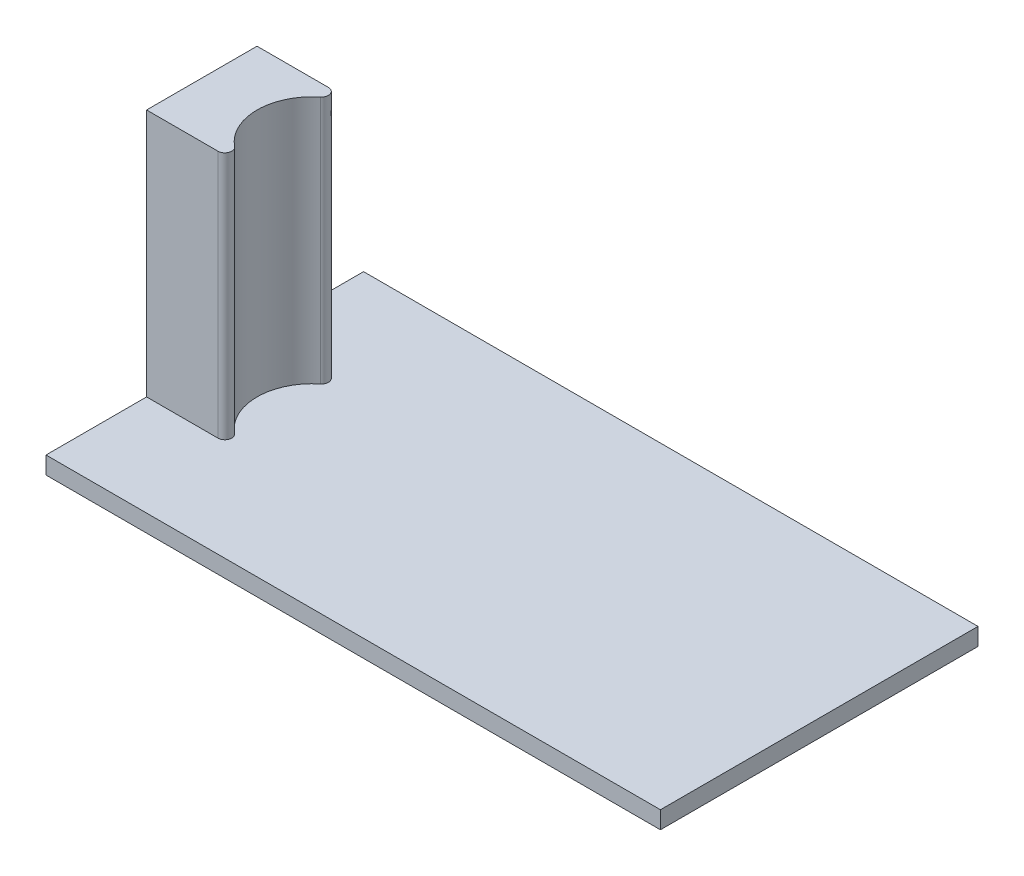
ISO-10303-21;
HEADER;
FILE_DESCRIPTION(('STEP AP214'),'2;1');
FILE_NAME('part.step','',(''),(''),'','','');
FILE_SCHEMA(('AUTOMOTIVE_DESIGN { 1 0 10303 214 1 1 1 1 }'));
ENDSEC;
DATA;
#1=APPLICATION_CONTEXT('core data for automotive mechanical design processes');
#2=APPLICATION_PROTOCOL_DEFINITION('international standard','automotive_design',2000,#1);
#3=PRODUCT_CONTEXT('',#1,'mechanical');
#4=PRODUCT('Part','Part','',(#3));
#5=PRODUCT_RELATED_PRODUCT_CATEGORY('part','',(#4));
#6=PRODUCT_DEFINITION_FORMATION('','',#4);
#7=PRODUCT_DEFINITION_CONTEXT('part definition',#1,'design');
#8=PRODUCT_DEFINITION('design','',#6,#7);
#9=PRODUCT_DEFINITION_SHAPE('','',#8);
#10=(LENGTH_UNIT() NAMED_UNIT(*) SI_UNIT(.MILLI.,.METRE.));
#11=(NAMED_UNIT(*) PLANE_ANGLE_UNIT() SI_UNIT($,.RADIAN.));
#12=(NAMED_UNIT(*) SI_UNIT($,.STERADIAN.) SOLID_ANGLE_UNIT());
#13=UNCERTAINTY_MEASURE_WITH_UNIT(LENGTH_MEASURE(1.E-05),#10,'distance_accuracy_value','');
#14=(GEOMETRIC_REPRESENTATION_CONTEXT(3) GLOBAL_UNCERTAINTY_ASSIGNED_CONTEXT((#13)) GLOBAL_UNIT_ASSIGNED_CONTEXT((#10,
#11,#12)) REPRESENTATION_CONTEXT('',''));
#15=CARTESIAN_POINT('',(0.,0.,0.));
#16=DIRECTION('',(0.,0.,1.));
#17=DIRECTION('',(1.,0.,0.));
#18=AXIS2_PLACEMENT_3D('',#15,#16,#17);
#19=CARTESIAN_POINT('',(-2.38125,57.15,-12.7));
#20=DIRECTION('',(0.,-1.,0.));
#21=DIRECTION('',(0.,0.,-1.));
#22=AXIS2_PLACEMENT_3D('',#19,#20,#21);
#23=CYLINDRICAL_SURFACE('',#22,12.7);
#24=CARTESIAN_POINT('',(-2.38125,0.,-12.7));
#25=DIRECTION('',(0.,1.,0.));
#26=DIRECTION('',(0.,0.,1.));
#27=AXIS2_PLACEMENT_3D('',#24,#25,#26);
#28=CIRCLE('',#27,12.7);
#29=CARTESIAN_POINT('',(-10.3636998853948,0.,-22.5777777777778));
#30=VERTEX_POINT('',#29);
#31=CARTESIAN_POINT('',(-10.3636998853948,0.,-2.82222222222222));
#32=VERTEX_POINT('',#31);
#33=EDGE_CURVE('E119',#30,#32,#28,.T.);
#34=ORIENTED_EDGE('',*,*,#33,.F.);
#35=DIRECTION('',(0.,-1.,0.));
#36=VECTOR('',#35,1.);
#37=CARTESIAN_POINT('',(-10.3636998853948,57.15,-22.5777777777778));
#38=LINE('',#37,#36);
#39=CARTESIAN_POINT('',(-10.3636998853948,57.15,-22.5777777777778));
#40=VERTEX_POINT('',#39);
#41=EDGE_CURVE('E11',#40,#30,#38,.T.);
#42=ORIENTED_EDGE('',*,*,#41,.F.);
#43=CARTESIAN_POINT('',(-2.38125,57.15,-12.7));
#44=DIRECTION('',(0.,1.,0.));
#45=DIRECTION('',(0.,0.,1.));
#46=AXIS2_PLACEMENT_3D('',#43,#44,#45);
#47=CIRCLE('',#46,12.7);
#48=CARTESIAN_POINT('',(-10.3636998853948,57.15,-2.82222222222222));
#49=VERTEX_POINT('',#48);
#50=EDGE_CURVE('E132',#40,#49,#47,.T.);
#51=ORIENTED_EDGE('',*,*,#50,.T.);
#52=DIRECTION('',(0.,-1.,0.));
#53=VECTOR('',#52,1.);
#54=CARTESIAN_POINT('',(-10.3636998853948,57.15,-2.82222222222222));
#55=LINE('',#54,#53);
#56=EDGE_CURVE('E78',#49,#32,#55,.T.);
#57=ORIENTED_EDGE('',*,*,#56,.T.);
#58=EDGE_LOOP('',(#34,#42,#51,#57));
#59=FACE_BOUND('',#58,.T.);
#60=ADVANCED_FACE('F35',(#59),#23,.F.);
#61=CARTESIAN_POINT('',(-11.3615061210692,57.15,-23.8125));
#62=DIRECTION('',(0.,-1.,0.));
#63=DIRECTION('',(0.,0.,-1.));
#64=AXIS2_PLACEMENT_3D('',#61,#62,#63);
#65=CYLINDRICAL_SURFACE('',#64,1.5875);
#66=CARTESIAN_POINT('',(-11.3615061210692,0.,-23.8125));
#67=DIRECTION('',(0.,1.,0.));
#68=DIRECTION('',(0.,0.,1.));
#69=AXIS2_PLACEMENT_3D('',#66,#67,#68);
#70=CIRCLE('',#69,1.5875);
#71=CARTESIAN_POINT('',(-11.3615061210692,0.,-25.4));
#72=VERTEX_POINT('',#71);
#73=EDGE_CURVE('E122',#72,#30,#70,.F.);
#74=ORIENTED_EDGE('',*,*,#73,.F.);
#75=DIRECTION('',(0.,-1.,0.));
#76=VECTOR('',#75,1.);
#77=CARTESIAN_POINT('',(-11.3615061210692,57.15,-25.4));
#78=LINE('',#77,#76);
#79=CARTESIAN_POINT('',(-11.3615061210692,57.15,-25.4));
#80=VERTEX_POINT('',#79);
#81=EDGE_CURVE('E43',#80,#72,#78,.T.);
#82=ORIENTED_EDGE('',*,*,#81,.F.);
#83=CARTESIAN_POINT('',(-11.3615061210692,57.15,-23.8125));
#84=DIRECTION('',(0.,1.,0.));
#85=DIRECTION('',(0.,0.,1.));
#86=AXIS2_PLACEMENT_3D('',#83,#84,#85);
#87=CIRCLE('',#86,1.5875);
#88=EDGE_CURVE('E114',#80,#40,#87,.F.);
#89=ORIENTED_EDGE('',*,*,#88,.T.);
#90=ORIENTED_EDGE('',*,*,#41,.T.);
#91=EDGE_LOOP('',(#74,#82,#89,#90));
#92=FACE_BOUND('',#91,.T.);
#93=ADVANCED_FACE('F142',(#92),#65,.T.);
#94=CARTESIAN_POINT('',(0.,57.15,-25.4));
#95=DIRECTION('',(0.,0.,-1.));
#96=DIRECTION('',(-1.,0.,0.));
#97=AXIS2_PLACEMENT_3D('',#94,#95,#96);
#98=PLANE('',#97);
#99=DIRECTION('',(1.,0.,0.));
#100=VECTOR('',#99,1.);
#101=CARTESIAN_POINT('',(0.,0.,-25.4));
#102=LINE('',#101,#100);
#103=CARTESIAN_POINT('',(-27.78125,0.,-25.4));
#104=VERTEX_POINT('',#103);
#105=EDGE_CURVE('E126',#104,#72,#102,.T.);
#106=ORIENTED_EDGE('',*,*,#105,.F.);
#107=DIRECTION('',(0.,-1.,0.));
#108=VECTOR('',#107,1.);
#109=CARTESIAN_POINT('',(-27.78125,57.15,-25.4));
#110=LINE('',#109,#108);
#111=CARTESIAN_POINT('',(-27.78125,57.15,-25.4));
#112=VERTEX_POINT('',#111);
#113=EDGE_CURVE('E102',#112,#104,#110,.T.);
#114=ORIENTED_EDGE('',*,*,#113,.F.);
#115=DIRECTION('',(1.,0.,0.));
#116=VECTOR('',#115,1.);
#117=CARTESIAN_POINT('',(0.,57.15,-25.4));
#118=LINE('',#117,#116);
#119=EDGE_CURVE('E112',#112,#80,#118,.T.);
#120=ORIENTED_EDGE('',*,*,#119,.T.);
#121=ORIENTED_EDGE('',*,*,#81,.T.);
#122=EDGE_LOOP('',(#106,#114,#120,#121));
#123=FACE_BOUND('',#122,.T.);
#124=ADVANCED_FACE('F138',(#123),#98,.T.);
#125=CARTESIAN_POINT('',(-27.78125,57.15,0.));
#126=DIRECTION('',(-1.,0.,0.));
#127=DIRECTION('',(0.,0.,1.));
#128=AXIS2_PLACEMENT_3D('',#125,#126,#127);
#129=PLANE('',#128);
#130=ORIENTED_EDGE('',*,*,#113,.T.);
#131=DIRECTION('',(0.,0.,-1.));
#132=VECTOR('',#131,1.);
#133=CARTESIAN_POINT('',(-27.78125,0.,23.130000102));
#134=LINE('',#133,#132);
#135=CARTESIAN_POINT('',(-27.78125,0.,-49.899999898));
#136=VERTEX_POINT('',#135);
#137=EDGE_CURVE('E147',#104,#136,#134,.T.);
#138=ORIENTED_EDGE('',*,*,#137,.T.);
#139=DIRECTION('',(0.,1.,0.));
#140=VECTOR('',#139,1.);
#141=CARTESIAN_POINT('',(-27.78125,-4.,-49.899999898));
#142=LINE('',#141,#140);
#143=CARTESIAN_POINT('',(-27.78125,-4.,-49.899999898));
#144=VERTEX_POINT('',#143);
#145=EDGE_CURVE('E123',#144,#136,#142,.T.);
#146=ORIENTED_EDGE('',*,*,#145,.F.);
#147=DIRECTION('',(0.,0.,-1.));
#148=VECTOR('',#147,1.);
#149=CARTESIAN_POINT('',(-27.78125,-4.,23.130000102));
#150=LINE('',#149,#148);
#151=CARTESIAN_POINT('',(-27.78125,-4.,23.130000102));
#152=VERTEX_POINT('',#151);
#153=EDGE_CURVE('E167',#152,#144,#150,.T.);
#154=ORIENTED_EDGE('',*,*,#153,.F.);
#155=DIRECTION('',(0.,1.,0.));
#156=VECTOR('',#155,1.);
#157=CARTESIAN_POINT('',(-27.78125,-4.,23.130000102));
#158=LINE('',#157,#156);
#159=CARTESIAN_POINT('',(-27.78125,0.,23.130000102));
#160=VERTEX_POINT('',#159);
#161=EDGE_CURVE('E168',#152,#160,#158,.T.);
#162=ORIENTED_EDGE('',*,*,#161,.T.);
#163=CARTESIAN_POINT('',(-27.78125,0.,0.));
#164=VERTEX_POINT('',#163);
#165=EDGE_CURVE('E101',#160,#164,#134,.T.);
#166=ORIENTED_EDGE('',*,*,#165,.T.);
#167=DIRECTION('',(0.,-1.,0.));
#168=VECTOR('',#167,1.);
#169=CARTESIAN_POINT('',(-27.78125,57.15,0.));
#170=LINE('',#169,#168);
#171=CARTESIAN_POINT('',(-27.78125,57.15,0.));
#172=VERTEX_POINT('',#171);
#173=EDGE_CURVE('E94',#172,#164,#170,.T.);
#174=ORIENTED_EDGE('',*,*,#173,.F.);
#175=DIRECTION('',(0.,0.,-1.));
#176=VECTOR('',#175,1.);
#177=CARTESIAN_POINT('',(-27.78125,57.15,0.));
#178=LINE('',#177,#176);
#179=EDGE_CURVE('E98',#172,#112,#178,.T.);
#180=ORIENTED_EDGE('',*,*,#179,.T.);
#181=EDGE_LOOP('',(#130,#138,#146,#154,#162,#166,#174,#180));
#182=FACE_BOUND('',#181,.T.);
#183=ADVANCED_FACE('F96',(#182),#129,.T.);
#184=CARTESIAN_POINT('',(0.,57.15,0.));
#185=DIRECTION('',(0.,0.,-1.));
#186=DIRECTION('',(-1.,0.,0.));
#187=AXIS2_PLACEMENT_3D('',#184,#185,#186);
#188=PLANE('',#187);
#189=DIRECTION('',(1.,0.,0.));
#190=VECTOR('',#189,1.);
#191=CARTESIAN_POINT('',(0.,0.,0.));
#192=LINE('',#191,#190);
#193=CARTESIAN_POINT('',(-11.3615061210692,0.,0.));
#194=VERTEX_POINT('',#193);
#195=EDGE_CURVE('E71',#164,#194,#192,.T.);
#196=ORIENTED_EDGE('',*,*,#195,.T.);
#197=DIRECTION('',(0.,-1.,0.));
#198=VECTOR('',#197,1.);
#199=CARTESIAN_POINT('',(-11.3615061210692,57.15,0.));
#200=LINE('',#199,#198);
#201=CARTESIAN_POINT('',(-11.3615061210692,57.15,0.));
#202=VERTEX_POINT('',#201);
#203=EDGE_CURVE('E103',#202,#194,#200,.T.);
#204=ORIENTED_EDGE('',*,*,#203,.F.);
#205=DIRECTION('',(1.,0.,0.));
#206=VECTOR('',#205,1.);
#207=CARTESIAN_POINT('',(0.,57.15,0.));
#208=LINE('',#207,#206);
#209=EDGE_CURVE('E105',#172,#202,#208,.T.);
#210=ORIENTED_EDGE('',*,*,#209,.F.);
#211=ORIENTED_EDGE('',*,*,#173,.T.);
#212=EDGE_LOOP('',(#196,#204,#210,#211));
#213=FACE_BOUND('',#212,.T.);
#214=ADVANCED_FACE('F106',(#213),#188,.F.);
#215=CARTESIAN_POINT('',(-11.3615061210692,57.15,-1.5875));
#216=DIRECTION('',(0.,-1.,0.));
#217=DIRECTION('',(0.,0.,-1.));
#218=AXIS2_PLACEMENT_3D('',#215,#216,#217);
#219=CYLINDRICAL_SURFACE('',#218,1.5875);
#220=CARTESIAN_POINT('',(-11.3615061210692,0.,-1.5875));
#221=DIRECTION('',(0.,1.,0.));
#222=DIRECTION('',(0.,0.,1.));
#223=AXIS2_PLACEMENT_3D('',#220,#221,#222);
#224=CIRCLE('',#223,1.5875);
#225=EDGE_CURVE('E130',#194,#32,#224,.T.);
#226=ORIENTED_EDGE('',*,*,#225,.T.);
#227=ORIENTED_EDGE('',*,*,#56,.F.);
#228=CARTESIAN_POINT('',(-11.3615061210692,57.15,-1.5875));
#229=DIRECTION('',(0.,1.,0.));
#230=DIRECTION('',(0.,0.,1.));
#231=AXIS2_PLACEMENT_3D('',#228,#229,#230);
#232=CIRCLE('',#231,1.5875);
#233=EDGE_CURVE('E51',#202,#49,#232,.T.);
#234=ORIENTED_EDGE('',*,*,#233,.F.);
#235=ORIENTED_EDGE('',*,*,#203,.T.);
#236=EDGE_LOOP('',(#226,#227,#234,#235));
#237=FACE_BOUND('',#236,.T.);
#238=ADVANCED_FACE('F185',(#237),#219,.T.);
#239=CARTESIAN_POINT('',(0.,57.15,0.));
#240=DIRECTION('',(0.,1.,0.));
#241=DIRECTION('',(0.,0.,1.));
#242=AXIS2_PLACEMENT_3D('',#239,#240,#241);
#243=PLANE('',#242);
#244=ORIENTED_EDGE('',*,*,#50,.F.);
#245=ORIENTED_EDGE('',*,*,#88,.F.);
#246=ORIENTED_EDGE('',*,*,#119,.F.);
#247=ORIENTED_EDGE('',*,*,#179,.F.);
#248=ORIENTED_EDGE('',*,*,#209,.T.);
#249=ORIENTED_EDGE('',*,*,#233,.T.);
#250=EDGE_LOOP('',(#244,#245,#246,#247,#248,#249));
#251=FACE_BOUND('',#250,.T.);
#252=ADVANCED_FACE('F109',(#251),#243,.T.);
#253=CARTESIAN_POINT('',(0.,0.,0.));
#254=DIRECTION('',(0.,-1.,0.));
#255=DIRECTION('',(0.,0.,-1.));
#256=AXIS2_PLACEMENT_3D('',#253,#254,#255);
#257=PLANE('',#256);
#258=ORIENTED_EDGE('',*,*,#195,.F.);
#259=ORIENTED_EDGE('',*,*,#165,.F.);
#260=DIRECTION('',(-1.,0.,0.));
#261=VECTOR('',#260,1.);
#262=CARTESIAN_POINT('',(-27.78125,0.,23.130000102));
#263=LINE('',#262,#261);
#264=CARTESIAN_POINT('',(113.51875,0.,23.130000102));
#265=VERTEX_POINT('',#264);
#266=EDGE_CURVE('E164',#265,#160,#263,.T.);
#267=ORIENTED_EDGE('',*,*,#266,.F.);
#268=DIRECTION('',(0.,0.,1.));
#269=VECTOR('',#268,1.);
#270=CARTESIAN_POINT('',(113.51875,0.,23.130000102));
#271=LINE('',#270,#269);
#272=CARTESIAN_POINT('',(113.51875,0.,-49.899999898));
#273=VERTEX_POINT('',#272);
#274=EDGE_CURVE('E223',#273,#265,#271,.T.);
#275=ORIENTED_EDGE('',*,*,#274,.F.);
#276=DIRECTION('',(1.,0.,0.));
#277=VECTOR('',#276,1.);
#278=CARTESIAN_POINT('',(-27.78125,0.,-49.899999898));
#279=LINE('',#278,#277);
#280=EDGE_CURVE('E151',#136,#273,#279,.T.);
#281=ORIENTED_EDGE('',*,*,#280,.F.);
#282=ORIENTED_EDGE('',*,*,#137,.F.);
#283=ORIENTED_EDGE('',*,*,#105,.T.);
#284=ORIENTED_EDGE('',*,*,#73,.T.);
#285=ORIENTED_EDGE('',*,*,#33,.T.);
#286=ORIENTED_EDGE('',*,*,#225,.F.);
#287=EDGE_LOOP('',(#258,#259,#267,#275,#281,#282,#283,#284,#285,#286));
#288=FACE_BOUND('',#287,.T.);
#289=ADVANCED_FACE('F144',(#288),#257,.F.);
#290=CARTESIAN_POINT('',(-27.78125,-4.,-49.899999898));
#291=DIRECTION('',(0.,0.,1.));
#292=DIRECTION('',(1.,0.,0.));
#293=AXIS2_PLACEMENT_3D('',#290,#291,#292);
#294=PLANE('',#293);
#295=ORIENTED_EDGE('',*,*,#280,.T.);
#296=DIRECTION('',(0.,-1.,0.));
#297=VECTOR('',#296,1.);
#298=CARTESIAN_POINT('',(113.51875,0.,-49.899999898));
#299=LINE('',#298,#297);
#300=CARTESIAN_POINT('',(113.51875,-4.,-49.899999898));
#301=VERTEX_POINT('',#300);
#302=EDGE_CURVE('E157',#273,#301,#299,.T.);
#303=ORIENTED_EDGE('',*,*,#302,.T.);
#304=DIRECTION('',(1.,0.,0.));
#305=VECTOR('',#304,1.);
#306=CARTESIAN_POINT('',(-27.78125,-4.,-49.899999898));
#307=LINE('',#306,#305);
#308=EDGE_CURVE('E229',#144,#301,#307,.T.);
#309=ORIENTED_EDGE('',*,*,#308,.F.);
#310=ORIENTED_EDGE('',*,*,#145,.T.);
#311=EDGE_LOOP('',(#295,#303,#309,#310));
#312=FACE_BOUND('',#311,.T.);
#313=ADVANCED_FACE('F191',(#312),#294,.F.);
#314=CARTESIAN_POINT('',(-27.78125,-4.,23.130000102));
#315=DIRECTION('',(0.,0.,-1.));
#316=DIRECTION('',(-1.,0.,0.));
#317=AXIS2_PLACEMENT_3D('',#314,#315,#316);
#318=PLANE('',#317);
#319=ORIENTED_EDGE('',*,*,#266,.T.);
#320=ORIENTED_EDGE('',*,*,#161,.F.);
#321=DIRECTION('',(-1.,0.,0.));
#322=VECTOR('',#321,1.);
#323=CARTESIAN_POINT('',(-27.78125,-4.,23.130000102));
#324=LINE('',#323,#322);
#325=CARTESIAN_POINT('',(113.51875,-4.,23.130000102));
#326=VERTEX_POINT('',#325);
#327=EDGE_CURVE('E161',#326,#152,#324,.T.);
#328=ORIENTED_EDGE('',*,*,#327,.F.);
#329=DIRECTION('',(0.,-1.,0.));
#330=VECTOR('',#329,1.);
#331=CARTESIAN_POINT('',(113.51875,0.,23.130000102));
#332=LINE('',#331,#330);
#333=EDGE_CURVE('E154',#265,#326,#332,.T.);
#334=ORIENTED_EDGE('',*,*,#333,.F.);
#335=EDGE_LOOP('',(#319,#320,#328,#334));
#336=FACE_BOUND('',#335,.T.);
#337=ADVANCED_FACE('F194',(#336),#318,.F.);
#338=CARTESIAN_POINT('',(0.,-4.,0.));
#339=DIRECTION('',(0.,-1.,0.));
#340=DIRECTION('',(0.,0.,-1.));
#341=AXIS2_PLACEMENT_3D('',#338,#339,#340);
#342=PLANE('',#341);
#343=ORIENTED_EDGE('',*,*,#153,.T.);
#344=ORIENTED_EDGE('',*,*,#308,.T.);
#345=DIRECTION('',(0.,0.,1.));
#346=VECTOR('',#345,1.);
#347=CARTESIAN_POINT('',(113.51875,-4.,23.130000102));
#348=LINE('',#347,#346);
#349=EDGE_CURVE('E214',#301,#326,#348,.T.);
#350=ORIENTED_EDGE('',*,*,#349,.T.);
#351=ORIENTED_EDGE('',*,*,#327,.T.);
#352=EDGE_LOOP('',(#343,#344,#350,#351));
#353=FACE_BOUND('',#352,.T.);
#354=ADVANCED_FACE('F198',(#353),#342,.T.);
#355=CARTESIAN_POINT('',(113.51875,0.,23.130000102));
#356=DIRECTION('',(1.,0.,0.));
#357=DIRECTION('',(0.,0.,-1.));
#358=AXIS2_PLACEMENT_3D('',#355,#356,#357);
#359=PLANE('',#358);
#360=ORIENTED_EDGE('',*,*,#349,.F.);
#361=ORIENTED_EDGE('',*,*,#302,.F.);
#362=ORIENTED_EDGE('',*,*,#274,.T.);
#363=ORIENTED_EDGE('',*,*,#333,.T.);
#364=EDGE_LOOP('',(#360,#361,#362,#363));
#365=FACE_BOUND('',#364,.T.);
#366=ADVANCED_FACE('F204',(#365),#359,.T.);
#367=CLOSED_SHELL('',(#60,#93,#124,#183,#214,#238,#252,#289,#313,#337,#354,#366));
#368=MANIFOLD_SOLID_BREP('B2',#367);
#369=ADVANCED_BREP_SHAPE_REPRESENTATION('',(#18,#368),#14);
#370=SHAPE_DEFINITION_REPRESENTATION(#9,#369);
ENDSEC;
END-ISO-10303-21;
